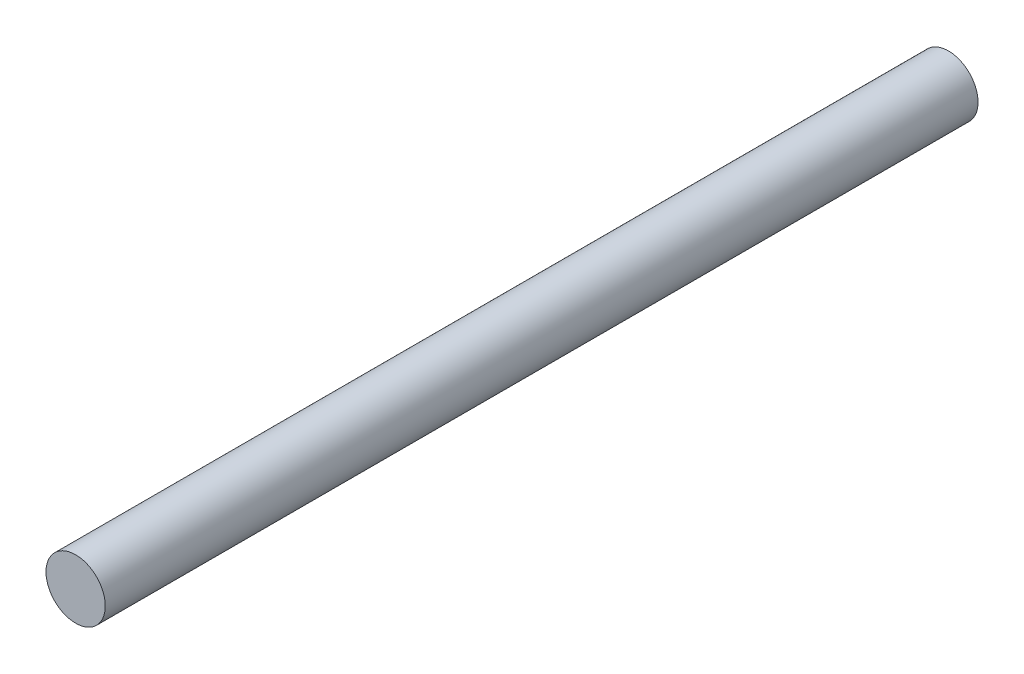
ISO-10303-21;
HEADER;
FILE_DESCRIPTION(('STEP AP214'),'2;1');
FILE_NAME('part.step','',(''),(''),'','','');
FILE_SCHEMA(('AUTOMOTIVE_DESIGN { 1 0 10303 214 1 1 1 1 }'));
ENDSEC;
DATA;
#1=APPLICATION_CONTEXT('core data for automotive mechanical design processes');
#2=APPLICATION_PROTOCOL_DEFINITION('international standard','automotive_design',2000,#1);
#3=PRODUCT_CONTEXT('',#1,'mechanical');
#4=PRODUCT('Part','Part','',(#3));
#5=PRODUCT_RELATED_PRODUCT_CATEGORY('part','',(#4));
#6=PRODUCT_DEFINITION_FORMATION('','',#4);
#7=PRODUCT_DEFINITION_CONTEXT('part definition',#1,'design');
#8=PRODUCT_DEFINITION('design','',#6,#7);
#9=PRODUCT_DEFINITION_SHAPE('','',#8);
#10=(LENGTH_UNIT() NAMED_UNIT(*) SI_UNIT(.MILLI.,.METRE.));
#11=(NAMED_UNIT(*) PLANE_ANGLE_UNIT() SI_UNIT($,.RADIAN.));
#12=(NAMED_UNIT(*) SI_UNIT($,.STERADIAN.) SOLID_ANGLE_UNIT());
#13=UNCERTAINTY_MEASURE_WITH_UNIT(LENGTH_MEASURE(1.E-05),#10,'distance_accuracy_value','');
#14=(GEOMETRIC_REPRESENTATION_CONTEXT(3) GLOBAL_UNCERTAINTY_ASSIGNED_CONTEXT((#13)) GLOBAL_UNIT_ASSIGNED_CONTEXT((#10,
#11,#12)) REPRESENTATION_CONTEXT('',''));
#15=CARTESIAN_POINT('',(0.,0.,0.));
#16=DIRECTION('',(0.,0.,1.));
#17=DIRECTION('',(1.,0.,0.));
#18=AXIS2_PLACEMENT_3D('',#15,#16,#17);
#19=CARTESIAN_POINT('',(0.,0.,58.42));
#20=DIRECTION('',(0.,0.,-1.));
#21=DIRECTION('',(-1.,0.,0.));
#22=AXIS2_PLACEMENT_3D('',#19,#20,#21);
#23=CYLINDRICAL_SURFACE('',#22,3.96875);
#24=CARTESIAN_POINT('',(0.,0.,58.42));
#25=DIRECTION('',(0.,0.,1.));
#26=DIRECTION('',(1.,0.,0.));
#27=AXIS2_PLACEMENT_3D('',#24,#25,#26);
#28=CIRCLE('',#27,3.96875);
#29=CARTESIAN_POINT('',(-3.96875,0.,58.42));
#30=VERTEX_POINT('',#29);
#31=EDGE_CURVE('E12',#30,#30,#28,.T.);
#32=CARTESIAN_POINT('',(0.,0.,-58.42));
#33=DIRECTION('',(0.,0.,1.));
#34=DIRECTION('',(1.,0.,0.));
#35=AXIS2_PLACEMENT_3D('',#32,#33,#34);
#36=CIRCLE('',#35,3.96875);
#37=CARTESIAN_POINT('',(-3.96875,0.,-58.42));
#38=VERTEX_POINT('',#37);
#39=EDGE_CURVE('E43',#38,#38,#36,.T.);
#40=CARTESIAN_POINT('',(-3.96875,0.,58.42));
#41=CARTESIAN_POINT('',(-3.96875,0.,57.2029166666667));
#42=CARTESIAN_POINT('',(-3.96875,0.,55.9858333333333));
#43=CARTESIAN_POINT('',(-3.96875,0.,53.5516666666667));
#44=CARTESIAN_POINT('',(-3.96875,0.,52.3345833333333));
#45=CARTESIAN_POINT('',(-3.96875,0.,49.9004166666667));
#46=CARTESIAN_POINT('',(-3.96875,0.,48.6833333333333));
#47=CARTESIAN_POINT('',(-3.96875,0.,46.2491666666667));
#48=CARTESIAN_POINT('',(-3.96875,0.,45.0320833333333));
#49=CARTESIAN_POINT('',(-3.96875,0.,42.5979166666667));
#50=CARTESIAN_POINT('',(-3.96875,0.,41.3808333333333));
#51=CARTESIAN_POINT('',(-3.96875,0.,38.9466666666667));
#52=CARTESIAN_POINT('',(-3.96875,0.,37.7295833333333));
#53=CARTESIAN_POINT('',(-3.96875,0.,35.2954166666667));
#54=CARTESIAN_POINT('',(-3.96875,0.,34.0783333333333));
#55=CARTESIAN_POINT('',(-3.96875,0.,31.6441666666667));
#56=CARTESIAN_POINT('',(-3.96875,0.,30.4270833333333));
#57=CARTESIAN_POINT('',(-3.96875,0.,27.9929166666667));
#58=CARTESIAN_POINT('',(-3.96875,0.,26.7758333333333));
#59=CARTESIAN_POINT('',(-3.96875,0.,24.3416666666667));
#60=CARTESIAN_POINT('',(-3.96875,0.,23.1245833333333));
#61=CARTESIAN_POINT('',(-3.96875,0.,20.6904166666667));
#62=CARTESIAN_POINT('',(-3.96875,0.,19.4733333333333));
#63=CARTESIAN_POINT('',(-3.96875,0.,17.0391666666667));
#64=CARTESIAN_POINT('',(-3.96875,0.,15.8220833333333));
#65=CARTESIAN_POINT('',(-3.96875,0.,13.3879166666667));
#66=CARTESIAN_POINT('',(-3.96875,0.,12.1708333333333));
#67=CARTESIAN_POINT('',(-3.96875,0.,9.73666666666666));
#68=CARTESIAN_POINT('',(-3.96875,0.,8.51958333333333));
#69=CARTESIAN_POINT('',(-3.96875,0.,6.08541666666666));
#70=CARTESIAN_POINT('',(-3.96875,0.,4.86833333333333));
#71=CARTESIAN_POINT('',(-3.96875,0.,2.43416666666666));
#72=CARTESIAN_POINT('',(-3.96875,0.,1.21708333333333));
#73=CARTESIAN_POINT('',(-3.96875,0.,-1.21708333333334));
#74=CARTESIAN_POINT('',(-3.96875,0.,-2.43416666666667));
#75=CARTESIAN_POINT('',(-3.96875,0.,-4.86833333333334));
#76=CARTESIAN_POINT('',(-3.96875,0.,-6.08541666666667));
#77=CARTESIAN_POINT('',(-3.96875,0.,-8.51958333333333));
#78=CARTESIAN_POINT('',(-3.96875,0.,-9.73666666666666));
#79=CARTESIAN_POINT('',(-3.96875,0.,-12.1708333333333));
#80=CARTESIAN_POINT('',(-3.96875,0.,-13.3879166666667));
#81=CARTESIAN_POINT('',(-3.96875,0.,-15.8220833333333));
#82=CARTESIAN_POINT('',(-3.96875,0.,-17.0391666666667));
#83=CARTESIAN_POINT('',(-3.96875,0.,-19.4733333333333));
#84=CARTESIAN_POINT('',(-3.96875,0.,-20.6904166666667));
#85=CARTESIAN_POINT('',(-3.96875,0.,-23.1245833333333));
#86=CARTESIAN_POINT('',(-3.96875,0.,-24.3416666666667));
#87=CARTESIAN_POINT('',(-3.96875,0.,-26.7758333333333));
#88=CARTESIAN_POINT('',(-3.96875,0.,-27.9929166666667));
#89=CARTESIAN_POINT('',(-3.96875,0.,-30.4270833333333));
#90=CARTESIAN_POINT('',(-3.96875,0.,-31.6441666666667));
#91=CARTESIAN_POINT('',(-3.96875,0.,-34.0783333333333));
#92=CARTESIAN_POINT('',(-3.96875,0.,-35.2954166666667));
#93=CARTESIAN_POINT('',(-3.96875,0.,-37.7295833333333));
#94=CARTESIAN_POINT('',(-3.96875,0.,-38.9466666666667));
#95=CARTESIAN_POINT('',(-3.96875,0.,-41.3808333333333));
#96=CARTESIAN_POINT('',(-3.96875,0.,-42.5979166666666));
#97=CARTESIAN_POINT('',(-3.96875,0.,-45.0320833333333));
#98=CARTESIAN_POINT('',(-3.96875,0.,-46.2491666666667));
#99=CARTESIAN_POINT('',(-3.96875,0.,-48.6833333333333));
#100=CARTESIAN_POINT('',(-3.96875,0.,-49.9004166666667));
#101=CARTESIAN_POINT('',(-3.96875,0.,-52.3345833333333));
#102=CARTESIAN_POINT('',(-3.96875,0.,-53.5516666666667));
#103=CARTESIAN_POINT('',(-3.96875,0.,-55.9858333333333));
#104=CARTESIAN_POINT('',(-3.96875,0.,-57.2029166666667));
#105=CARTESIAN_POINT('',(-3.96875,0.,-58.42));
#106=B_SPLINE_CURVE_WITH_KNOTS('',3,(#40,#41,#42,#43,#44,#45,#46,#47,#48,#49,#50,#51,#52,#53,
#54,#55,#56,#57,#58,#59,#60,#61,#62,#63,#64,#65,#66,#67,#68,#69,#70,#71,#72,#73,#74,#75,#76,#77,
#78,#79,#80,#81,#82,#83,#84,#85,#86,#87,#88,#89,#90,#91,#92,#93,#94,#95,#96,#97,#98,#99,#100,
#101,#102,#103,#104,#105),.UNSPECIFIED.,.F.,.F.,(4,2,2,2,2,2,2,2,2,2,2,2,2,2,2,2,2,2,2,2,2,2,2,
2,2,2,2,2,2,2,2,2,4),(0.,3.65124999999999,7.3025,10.95375,14.605,18.25625,21.9075,25.55875,
29.21,32.86125,36.5125,40.16375,43.815,47.46625,51.1175,54.76875,58.42,62.07125,65.7225,
69.37375,73.025,76.67625,80.3275,83.97875,87.63,91.28125,94.9325,98.58375,102.235,105.88625,
109.5375,113.18875,116.84),.UNSPECIFIED.);
#107=EDGE_CURVE('BSEAM40',#30,#38,#106,.T.);
#108=ORIENTED_EDGE('',*,*,#31,.F.);
#109=ORIENTED_EDGE('',*,*,#39,.T.);
#110=ORIENTED_EDGE('',*,*,#107,.T.);
#111=ORIENTED_EDGE('',*,*,#107,.F.);
#112=EDGE_LOOP('',(#108,#110,#109,#111));
#113=FACE_BOUND('',#112,.T.);
#114=ADVANCED_FACE('F40',(#113),#23,.T.);
#115=CARTESIAN_POINT('',(0.,0.,58.42));
#116=DIRECTION('',(0.,0.,1.));
#117=DIRECTION('',(1.,0.,0.));
#118=AXIS2_PLACEMENT_3D('',#115,#116,#117);
#119=PLANE('',#118);
#120=ORIENTED_EDGE('',*,*,#31,.T.);
#121=EDGE_LOOP('',(#120));
#122=FACE_BOUND('',#121,.T.);
#123=ADVANCED_FACE('F55',(#122),#119,.T.);
#124=CARTESIAN_POINT('',(0.,0.,-58.42));
#125=DIRECTION('',(0.,0.,1.));
#126=DIRECTION('',(1.,0.,0.));
#127=AXIS2_PLACEMENT_3D('',#124,#125,#126);
#128=PLANE('',#127);
#129=ORIENTED_EDGE('',*,*,#39,.F.);
#130=EDGE_LOOP('',(#129));
#131=FACE_BOUND('',#130,.T.);
#132=ADVANCED_FACE('F53',(#131),#128,.F.);
#133=CLOSED_SHELL('',(#114,#123,#132));
#134=MANIFOLD_SOLID_BREP('B2',#133);
#135=ADVANCED_BREP_SHAPE_REPRESENTATION('',(#18,#134),#14);
#136=SHAPE_DEFINITION_REPRESENTATION(#9,#135);
ENDSEC;
END-ISO-10303-21;
